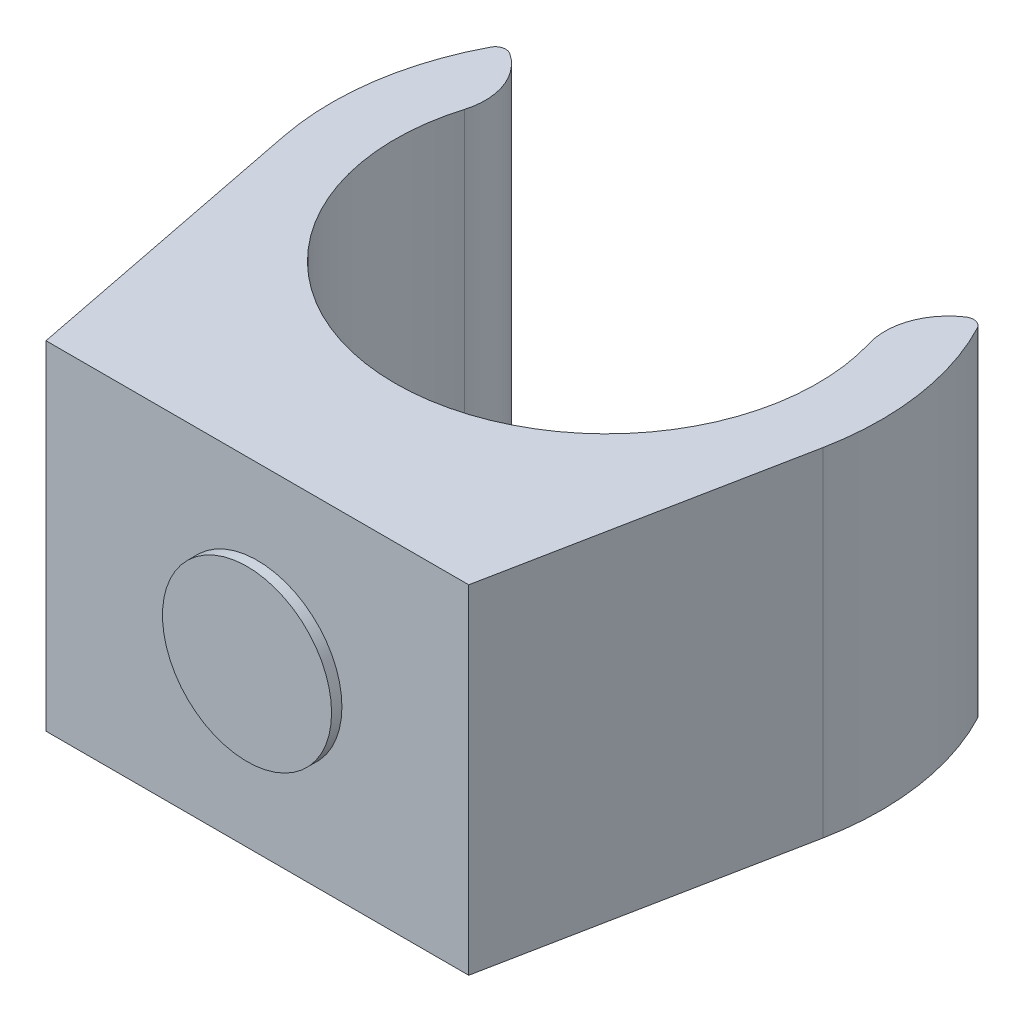
ISO-10303-21;
HEADER;
FILE_DESCRIPTION(('STEP AP214'),'2;1');
FILE_NAME('part.step','',(''),(''),'','','');
FILE_SCHEMA(('AUTOMOTIVE_DESIGN { 1 0 10303 214 1 1 1 1 }'));
ENDSEC;
DATA;
#1=APPLICATION_CONTEXT('core data for automotive mechanical design processes');
#2=APPLICATION_PROTOCOL_DEFINITION('international standard','automotive_design',2000,#1);
#3=PRODUCT_CONTEXT('',#1,'mechanical');
#4=PRODUCT('Part','Part','',(#3));
#5=PRODUCT_RELATED_PRODUCT_CATEGORY('part','',(#4));
#6=PRODUCT_DEFINITION_FORMATION('','',#4);
#7=PRODUCT_DEFINITION_CONTEXT('part definition',#1,'design');
#8=PRODUCT_DEFINITION('design','',#6,#7);
#9=PRODUCT_DEFINITION_SHAPE('','',#8);
#10=(LENGTH_UNIT() NAMED_UNIT(*) SI_UNIT(.MILLI.,.METRE.));
#11=(NAMED_UNIT(*) PLANE_ANGLE_UNIT() SI_UNIT($,.RADIAN.));
#12=(NAMED_UNIT(*) SI_UNIT($,.STERADIAN.) SOLID_ANGLE_UNIT());
#13=UNCERTAINTY_MEASURE_WITH_UNIT(LENGTH_MEASURE(1.E-05),#10,'distance_accuracy_value','');
#14=(GEOMETRIC_REPRESENTATION_CONTEXT(3) GLOBAL_UNCERTAINTY_ASSIGNED_CONTEXT((#13)) GLOBAL_UNIT_ASSIGNED_CONTEXT((#10,
#11,#12)) REPRESENTATION_CONTEXT('',''));
#15=CARTESIAN_POINT('',(0.,0.,0.));
#16=DIRECTION('',(0.,0.,1.));
#17=DIRECTION('',(1.,0.,0.));
#18=AXIS2_PLACEMENT_3D('',#15,#16,#17);
#19=CARTESIAN_POINT('',(0.,16.,0.));
#20=DIRECTION('',(0.,-1.,0.));
#21=DIRECTION('',(0.,0.,-1.));
#22=AXIS2_PLACEMENT_3D('',#19,#20,#21);
#23=CYLINDRICAL_SURFACE('',#22,13.);
#24=DIRECTION('',(0.,1.,0.));
#25=VECTOR('',#24,1.);
#26=CARTESIAN_POINT('',(-12.7553175190089,-29.0996993118991,2.51035355861762));
#27=LINE('',#26,#25);
#28=CARTESIAN_POINT('',(-12.7553175190089,0.,2.51035355861762));
#29=VERTEX_POINT('',#28);
#30=CARTESIAN_POINT('',(-12.7553175190089,16.,2.51035355861762));
#31=VERTEX_POINT('',#30);
#32=EDGE_CURVE('E60',#29,#31,#27,.T.);
#33=ORIENTED_EDGE('',*,*,#32,.T.);
#34=CARTESIAN_POINT('',(0.,16.,0.));
#35=DIRECTION('',(0.,1.,0.));
#36=DIRECTION('',(0.,0.,1.));
#37=AXIS2_PLACEMENT_3D('',#34,#35,#36);
#38=CIRCLE('',#37,13.);
#39=CARTESIAN_POINT('',(-11.5117782980847,16.,-6.03978148741711));
#40=VERTEX_POINT('',#39);
#41=EDGE_CURVE('E139',#40,#31,#38,.T.);
#42=ORIENTED_EDGE('',*,*,#41,.F.);
#43=DIRECTION('',(0.,-1.,0.));
#44=VECTOR('',#43,1.);
#45=CARTESIAN_POINT('',(-11.5117782980847,16.,-6.03978148741711));
#46=LINE('',#45,#44);
#47=CARTESIAN_POINT('',(-11.5117782980847,0.,-6.03978148741711));
#48=VERTEX_POINT('',#47);
#49=EDGE_CURVE('E186',#40,#48,#46,.T.);
#50=ORIENTED_EDGE('',*,*,#49,.T.);
#51=CARTESIAN_POINT('',(0.,0.,0.));
#52=DIRECTION('',(0.,1.,0.));
#53=DIRECTION('',(0.,0.,1.));
#54=AXIS2_PLACEMENT_3D('',#51,#52,#53);
#55=CIRCLE('',#54,13.);
#56=EDGE_CURVE('E158',#48,#29,#55,.T.);
#57=ORIENTED_EDGE('',*,*,#56,.T.);
#58=EDGE_LOOP('',(#33,#42,#50,#57));
#59=FACE_BOUND('',#58,.T.);
#60=ADVANCED_FACE('F37',(#59),#23,.T.);
#61=CARTESIAN_POINT('',(0.,16.,0.));
#62=DIRECTION('',(0.,-1.,0.));
#63=DIRECTION('',(0.,0.,-1.));
#64=AXIS2_PLACEMENT_3D('',#61,#62,#63);
#65=CYLINDRICAL_SURFACE('',#64,10.);
#66=DIRECTION('',(0.,-1.,0.));
#67=VECTOR('',#66,1.);
#68=CARTESIAN_POINT('',(9.58034703854102,16.,-2.8665223915257));
#69=LINE('',#68,#67);
#70=CARTESIAN_POINT('',(9.58034703854102,16.,-2.8665223915257));
#71=VERTEX_POINT('',#70);
#72=CARTESIAN_POINT('',(9.58034703854102,0.,-2.8665223915257));
#73=VERTEX_POINT('',#72);
#74=EDGE_CURVE('E168',#71,#73,#69,.T.);
#75=ORIENTED_EDGE('',*,*,#74,.T.);
#76=CARTESIAN_POINT('',(0.,0.,0.));
#77=DIRECTION('',(0.,1.,0.));
#78=DIRECTION('',(0.,0.,1.));
#79=AXIS2_PLACEMENT_3D('',#76,#77,#78);
#80=CIRCLE('',#79,10.);
#81=CARTESIAN_POINT('',(-9.58034703854102,0.,-2.8665223915257));
#82=VERTEX_POINT('',#81);
#83=EDGE_CURVE('E155',#82,#73,#80,.T.);
#84=ORIENTED_EDGE('',*,*,#83,.F.);
#85=DIRECTION('',(0.,-1.,0.));
#86=VECTOR('',#85,1.);
#87=CARTESIAN_POINT('',(-9.58034703854102,16.,-2.8665223915257));
#88=LINE('',#87,#86);
#89=CARTESIAN_POINT('',(-9.58034703854102,16.,-2.8665223915257));
#90=VERTEX_POINT('',#89);
#91=EDGE_CURVE('E171',#82,#90,#88,.F.);
#92=ORIENTED_EDGE('',*,*,#91,.T.);
#93=CARTESIAN_POINT('',(0.,16.,0.));
#94=DIRECTION('',(0.,1.,0.));
#95=DIRECTION('',(0.,0.,1.));
#96=AXIS2_PLACEMENT_3D('',#93,#94,#95);
#97=CIRCLE('',#96,10.);
#98=EDGE_CURVE('E156',#90,#71,#97,.T.);
#99=ORIENTED_EDGE('',*,*,#98,.T.);
#100=EDGE_LOOP('',(#75,#84,#92,#99));
#101=FACE_BOUND('',#100,.T.);
#102=ADVANCED_FACE('F223',(#101),#65,.F.);
#103=CARTESIAN_POINT('',(12.7553175190089,16.,2.51035355861762));
#104=VERTEX_POINT('',#103);
#105=CARTESIAN_POINT('',(11.5117782980847,16.,-6.03978148741711));
#106=VERTEX_POINT('',#105);
#107=EDGE_CURVE('E52',#104,#106,#38,.T.);
#108=ORIENTED_EDGE('',*,*,#107,.F.);
#109=DIRECTION('',(0.,1.,0.));
#110=VECTOR('',#109,1.);
#111=CARTESIAN_POINT('',(12.7553175190089,-29.0996993118991,2.51035355861762));
#112=LINE('',#111,#110);
#113=CARTESIAN_POINT('',(12.7553175190089,0.,2.51035355861762));
#114=VERTEX_POINT('',#113);
#115=EDGE_CURVE('E146',#114,#104,#112,.T.);
#116=ORIENTED_EDGE('',*,*,#115,.F.);
#117=CARTESIAN_POINT('',(11.5117782980847,0.,-6.03978148741711));
#118=VERTEX_POINT('',#117);
#119=EDGE_CURVE('E162',#114,#118,#55,.T.);
#120=ORIENTED_EDGE('',*,*,#119,.T.);
#121=DIRECTION('',(0.,-1.,0.));
#122=VECTOR('',#121,1.);
#123=CARTESIAN_POINT('',(11.5117782980847,16.,-6.03978148741711));
#124=LINE('',#123,#122);
#125=EDGE_CURVE('E189',#118,#106,#124,.F.);
#126=ORIENTED_EDGE('',*,*,#125,.T.);
#127=EDGE_LOOP('',(#108,#116,#120,#126));
#128=FACE_BOUND('',#127,.T.);
#129=ADVANCED_FACE('F213',(#128),#23,.T.);
#130=CARTESIAN_POINT('',(-25.4204887836564,16.,3.25000000000001));
#131=DIRECTION('',(0.,1.,0.));
#132=DIRECTION('',(0.,0.,1.));
#133=AXIS2_PLACEMENT_3D('',#130,#131,#132);
#134=PLANE('',#133);
#135=CARTESIAN_POINT('',(12.4544511501033,16.,-3.72647910898341));
#136=DIRECTION('',(0.,1.,0.));
#137=DIRECTION('',(0.,0.,1.));
#138=AXIS2_PLACEMENT_3D('',#135,#136,#137);
#139=CIRCLE('',#138,3.);
#140=CARTESIAN_POINT('',(10.791930883154,16.,-6.22368281753075));
#141=VERTEX_POINT('',#140);
#142=EDGE_CURVE('E173',#141,#71,#139,.T.);
#143=ORIENTED_EDGE('',*,*,#142,.T.);
#144=ORIENTED_EDGE('',*,*,#98,.F.);
#145=CARTESIAN_POINT('',(-12.4544511501033,16.,-3.72647910898341));
#146=DIRECTION('',(0.,1.,0.));
#147=DIRECTION('',(0.,0.,1.));
#148=AXIS2_PLACEMENT_3D('',#145,#146,#147);
#149=CIRCLE('',#148,3.);
#150=CARTESIAN_POINT('',(-10.791930883154,16.,-6.22368281753076));
#151=VERTEX_POINT('',#150);
#152=EDGE_CURVE('E175',#90,#151,#149,.T.);
#153=ORIENTED_EDGE('',*,*,#152,.T.);
#154=CARTESIAN_POINT('',(-11.0690175943122,16.,-5.80748219943953));
#155=DIRECTION('',(0.,1.,0.));
#156=DIRECTION('',(0.,0.,1.));
#157=AXIS2_PLACEMENT_3D('',#154,#155,#156);
#158=CIRCLE('',#157,0.5);
#159=EDGE_CURVE('E191',#151,#40,#158,.T.);
#160=ORIENTED_EDGE('',*,*,#159,.T.);
#161=ORIENTED_EDGE('',*,*,#41,.T.);
#162=DIRECTION('',(0.193104119893663,0.,0.981178270692994));
#163=VECTOR('',#162,1.);
#164=CARTESIAN_POINT('',(-12.7553175190089,16.,2.51035355861762));
#165=LINE('',#164,#163);
#166=CARTESIAN_POINT('',(-10.,16.,16.5103535586176));
#167=VERTEX_POINT('',#166);
#168=EDGE_CURVE('E121',#31,#167,#165,.T.);
#169=ORIENTED_EDGE('',*,*,#168,.T.);
#170=DIRECTION('',(1.,0.,0.));
#171=VECTOR('',#170,1.);
#172=CARTESIAN_POINT('',(-10.,16.,16.5103535586176));
#173=LINE('',#172,#171);
#174=CARTESIAN_POINT('',(10.,16.,16.5103535586176));
#175=VERTEX_POINT('',#174);
#176=EDGE_CURVE('E129',#167,#175,#173,.T.);
#177=ORIENTED_EDGE('',*,*,#176,.T.);
#178=DIRECTION('',(0.193104119893663,0.,-0.981178270692994));
#179=VECTOR('',#178,1.);
#180=CARTESIAN_POINT('',(12.7553175190089,16.,2.51035355861762));
#181=LINE('',#180,#179);
#182=EDGE_CURVE('E135',#175,#104,#181,.T.);
#183=ORIENTED_EDGE('',*,*,#182,.T.);
#184=ORIENTED_EDGE('',*,*,#107,.T.);
#185=CARTESIAN_POINT('',(11.0690175943122,16.,-5.80748219943953));
#186=DIRECTION('',(0.,1.,0.));
#187=DIRECTION('',(0.,0.,1.));
#188=AXIS2_PLACEMENT_3D('',#185,#186,#187);
#189=CIRCLE('',#188,0.5);
#190=EDGE_CURVE('E193',#106,#141,#189,.T.);
#191=ORIENTED_EDGE('',*,*,#190,.T.);
#192=EDGE_LOOP('',(#143,#144,#153,#160,#161,#169,#177,#183,#184,#191));
#193=FACE_BOUND('',#192,.T.);
#194=ADVANCED_FACE('F138',(#193),#134,.T.);
#195=CARTESIAN_POINT('',(-25.4204887836564,0.,3.25000000000001));
#196=DIRECTION('',(0.,1.,0.));
#197=DIRECTION('',(0.,0.,1.));
#198=AXIS2_PLACEMENT_3D('',#195,#196,#197);
#199=PLANE('',#198);
#200=ORIENTED_EDGE('',*,*,#119,.F.);
#201=DIRECTION('',(-0.193104119893663,0.,0.981178270692994));
#202=VECTOR('',#201,1.);
#203=CARTESIAN_POINT('',(12.7553175190089,0.,2.51035355861762));
#204=LINE('',#203,#202);
#205=CARTESIAN_POINT('',(10.,0.,16.5103535586176));
#206=VERTEX_POINT('',#205);
#207=EDGE_CURVE('E142',#114,#206,#204,.T.);
#208=ORIENTED_EDGE('',*,*,#207,.T.);
#209=DIRECTION('',(-1.,0.,0.));
#210=VECTOR('',#209,1.);
#211=CARTESIAN_POINT('',(-10.,0.,16.5103535586176));
#212=LINE('',#211,#210);
#213=CARTESIAN_POINT('',(-10.,0.,16.5103535586176));
#214=VERTEX_POINT('',#213);
#215=EDGE_CURVE('E148',#206,#214,#212,.T.);
#216=ORIENTED_EDGE('',*,*,#215,.T.);
#217=DIRECTION('',(-0.193104119893663,0.,-0.981178270692994));
#218=VECTOR('',#217,1.);
#219=CARTESIAN_POINT('',(-12.7553175190089,0.,2.51035355861762));
#220=LINE('',#219,#218);
#221=EDGE_CURVE('E123',#214,#29,#220,.T.);
#222=ORIENTED_EDGE('',*,*,#221,.T.);
#223=ORIENTED_EDGE('',*,*,#56,.F.);
#224=CARTESIAN_POINT('',(-11.0690175943122,0.,-5.80748219943953));
#225=DIRECTION('',(0.,1.,0.));
#226=DIRECTION('',(0.,0.,1.));
#227=AXIS2_PLACEMENT_3D('',#224,#225,#226);
#228=CIRCLE('',#227,0.5);
#229=CARTESIAN_POINT('',(-10.791930883154,0.,-6.22368281753076));
#230=VERTEX_POINT('',#229);
#231=EDGE_CURVE('E181',#48,#230,#228,.F.);
#232=ORIENTED_EDGE('',*,*,#231,.T.);
#233=CARTESIAN_POINT('',(-12.4544511501033,0.,-3.72647910898341));
#234=DIRECTION('',(0.,1.,0.));
#235=DIRECTION('',(0.,0.,1.));
#236=AXIS2_PLACEMENT_3D('',#233,#234,#235);
#237=CIRCLE('',#236,3.);
#238=EDGE_CURVE('E166',#230,#82,#237,.F.);
#239=ORIENTED_EDGE('',*,*,#238,.T.);
#240=ORIENTED_EDGE('',*,*,#83,.T.);
#241=CARTESIAN_POINT('',(12.4544511501033,0.,-3.72647910898341));
#242=DIRECTION('',(0.,1.,0.));
#243=DIRECTION('',(0.,0.,1.));
#244=AXIS2_PLACEMENT_3D('',#241,#242,#243);
#245=CIRCLE('',#244,3.);
#246=CARTESIAN_POINT('',(10.791930883154,0.,-6.22368281753075));
#247=VERTEX_POINT('',#246);
#248=EDGE_CURVE('E160',#73,#247,#245,.F.);
#249=ORIENTED_EDGE('',*,*,#248,.T.);
#250=CARTESIAN_POINT('',(11.0690175943122,0.,-5.80748219943953));
#251=DIRECTION('',(0.,1.,0.));
#252=DIRECTION('',(0.,0.,1.));
#253=AXIS2_PLACEMENT_3D('',#250,#251,#252);
#254=CIRCLE('',#253,0.5);
#255=EDGE_CURVE('E183',#247,#118,#254,.F.);
#256=ORIENTED_EDGE('',*,*,#255,.T.);
#257=EDGE_LOOP('',(#200,#208,#216,#222,#223,#232,#239,#240,#249,#256));
#258=FACE_BOUND('',#257,.T.);
#259=ADVANCED_FACE('F206',(#258),#199,.F.);
#260=CARTESIAN_POINT('',(-12.4544511501033,16.,-3.72647910898341));
#261=DIRECTION('',(0.,-1.,0.));
#262=DIRECTION('',(0.,0.,-1.));
#263=AXIS2_PLACEMENT_3D('',#260,#261,#262);
#264=CYLINDRICAL_SURFACE('',#263,3.);
#265=ORIENTED_EDGE('',*,*,#238,.F.);
#266=DIRECTION('',(0.,-1.,0.));
#267=VECTOR('',#266,1.);
#268=CARTESIAN_POINT('',(-10.791930883154,16.,-6.22368281753076));
#269=LINE('',#268,#267);
#270=EDGE_CURVE('E45',#230,#151,#269,.F.);
#271=ORIENTED_EDGE('',*,*,#270,.T.);
#272=ORIENTED_EDGE('',*,*,#152,.F.);
#273=ORIENTED_EDGE('',*,*,#91,.F.);
#274=EDGE_LOOP('',(#265,#271,#272,#273));
#275=FACE_BOUND('',#274,.T.);
#276=ADVANCED_FACE('F198',(#275),#264,.T.);
#277=CARTESIAN_POINT('',(12.4544511501033,16.,-3.72647910898341));
#278=DIRECTION('',(0.,-1.,0.));
#279=DIRECTION('',(0.,0.,-1.));
#280=AXIS2_PLACEMENT_3D('',#277,#278,#279);
#281=CYLINDRICAL_SURFACE('',#280,3.);
#282=ORIENTED_EDGE('',*,*,#142,.F.);
#283=DIRECTION('',(0.,-1.,0.));
#284=VECTOR('',#283,1.);
#285=CARTESIAN_POINT('',(10.791930883154,16.,-6.22368281753075));
#286=LINE('',#285,#284);
#287=EDGE_CURVE('E178',#141,#247,#286,.T.);
#288=ORIENTED_EDGE('',*,*,#287,.T.);
#289=ORIENTED_EDGE('',*,*,#248,.F.);
#290=ORIENTED_EDGE('',*,*,#74,.F.);
#291=EDGE_LOOP('',(#282,#288,#289,#290));
#292=FACE_BOUND('',#291,.T.);
#293=ADVANCED_FACE('F219',(#292),#281,.T.);
#294=CARTESIAN_POINT('',(11.0690175943122,16.,-5.80748219943953));
#295=DIRECTION('',(0.,-1.,0.));
#296=DIRECTION('',(0.,0.,-1.));
#297=AXIS2_PLACEMENT_3D('',#294,#295,#296);
#298=CYLINDRICAL_SURFACE('',#297,0.5);
#299=ORIENTED_EDGE('',*,*,#190,.F.);
#300=ORIENTED_EDGE('',*,*,#125,.F.);
#301=ORIENTED_EDGE('',*,*,#255,.F.);
#302=ORIENTED_EDGE('',*,*,#287,.F.);
#303=EDGE_LOOP('',(#299,#300,#301,#302));
#304=FACE_BOUND('',#303,.T.);
#305=ADVANCED_FACE('F216',(#304),#298,.T.);
#306=CARTESIAN_POINT('',(-11.0690175943122,16.,-5.80748219943953));
#307=DIRECTION('',(0.,-1.,0.));
#308=DIRECTION('',(0.,0.,-1.));
#309=AXIS2_PLACEMENT_3D('',#306,#307,#308);
#310=CYLINDRICAL_SURFACE('',#309,0.5);
#311=ORIENTED_EDGE('',*,*,#159,.F.);
#312=ORIENTED_EDGE('',*,*,#270,.F.);
#313=ORIENTED_EDGE('',*,*,#231,.F.);
#314=ORIENTED_EDGE('',*,*,#49,.F.);
#315=EDGE_LOOP('',(#311,#312,#313,#314));
#316=FACE_BOUND('',#315,.T.);
#317=ADVANCED_FACE('F39',(#316),#310,.T.);
#318=CARTESIAN_POINT('',(12.7553175190089,-29.0996993118991,2.51035355861762));
#319=DIRECTION('',(0.981178270692994,0.,0.193104119893663));
#320=DIRECTION('',(0.193104119893663,0.,-0.981178270692994));
#321=AXIS2_PLACEMENT_3D('',#318,#319,#320);
#322=PLANE('',#321);
#323=ORIENTED_EDGE('',*,*,#207,.F.);
#324=ORIENTED_EDGE('',*,*,#115,.T.);
#325=ORIENTED_EDGE('',*,*,#182,.F.);
#326=DIRECTION('',(0.,1.,0.));
#327=VECTOR('',#326,1.);
#328=CARTESIAN_POINT('',(10.,-29.0996993118991,16.5103535586176));
#329=LINE('',#328,#327);
#330=EDGE_CURVE('E126',#206,#175,#329,.T.);
#331=ORIENTED_EDGE('',*,*,#330,.F.);
#332=EDGE_LOOP('',(#323,#324,#325,#331));
#333=FACE_BOUND('',#332,.T.);
#334=ADVANCED_FACE('F209',(#333),#322,.T.);
#335=CARTESIAN_POINT('',(-10.,-29.0996993118991,16.5103535586176));
#336=DIRECTION('',(0.,0.,1.));
#337=DIRECTION('',(1.,0.,0.));
#338=AXIS2_PLACEMENT_3D('',#335,#336,#337);
#339=PLANE('',#338);
#340=CARTESIAN_POINT('',(0.,8.,16.5103535586176));
#341=DIRECTION('',(0.,0.,1.));
#342=DIRECTION('',(1.,0.,0.));
#343=AXIS2_PLACEMENT_3D('',#340,#341,#342);
#344=CIRCLE('',#343,4.);
#345=CARTESIAN_POINT('',(4.,8.,16.5103535586176));
#346=VERTEX_POINT('',#345);
#347=EDGE_CURVE('E11',#346,#346,#344,.F.);
#348=ORIENTED_EDGE('',*,*,#347,.T.);
#349=EDGE_LOOP('',(#348));
#350=FACE_BOUND('',#349,.T.);
#351=ORIENTED_EDGE('',*,*,#215,.F.);
#352=ORIENTED_EDGE('',*,*,#330,.T.);
#353=ORIENTED_EDGE('',*,*,#176,.F.);
#354=DIRECTION('',(0.,1.,0.));
#355=VECTOR('',#354,1.);
#356=CARTESIAN_POINT('',(-10.,-29.0996993118991,16.5103535586176));
#357=LINE('',#356,#355);
#358=EDGE_CURVE('E117',#214,#167,#357,.T.);
#359=ORIENTED_EDGE('',*,*,#358,.F.);
#360=EDGE_LOOP('',(#351,#352,#353,#359));
#361=FACE_BOUND('',#360,.T.);
#362=ADVANCED_FACE('F130',(#350,#361),#339,.T.);
#363=CARTESIAN_POINT('',(-12.7553175190089,-29.0996993118991,2.51035355861762));
#364=DIRECTION('',(-0.981178270692994,0.,0.193104119893663));
#365=DIRECTION('',(0.193104119893663,0.,0.981178270692994));
#366=AXIS2_PLACEMENT_3D('',#363,#364,#365);
#367=PLANE('',#366);
#368=ORIENTED_EDGE('',*,*,#221,.F.);
#369=ORIENTED_EDGE('',*,*,#358,.T.);
#370=ORIENTED_EDGE('',*,*,#168,.F.);
#371=ORIENTED_EDGE('',*,*,#32,.F.);
#372=EDGE_LOOP('',(#368,#369,#370,#371));
#373=FACE_BOUND('',#372,.T.);
#374=ADVANCED_FACE('F119',(#373),#367,.T.);
#375=CARTESIAN_POINT('',(0.,8.,17.));
#376=DIRECTION('',(0.,0.,1.));
#377=DIRECTION('',(1.,0.,0.));
#378=AXIS2_PLACEMENT_3D('',#375,#376,#377);
#379=PLANE('',#378);
#380=CARTESIAN_POINT('',(0.,8.,17.));
#381=DIRECTION('',(0.,0.,1.));
#382=DIRECTION('',(1.,0.,0.));
#383=AXIS2_PLACEMENT_3D('',#380,#381,#382);
#384=CIRCLE('',#383,4.);
#385=CARTESIAN_POINT('',(4.,8.,17.));
#386=VERTEX_POINT('',#385);
#387=EDGE_CURVE('E152',#386,#386,#384,.T.);
#388=ORIENTED_EDGE('',*,*,#387,.T.);
#389=EDGE_LOOP('',(#388));
#390=FACE_BOUND('',#389,.T.);
#391=ADVANCED_FACE('F252',(#390),#379,.T.);
#392=CARTESIAN_POINT('',(0.,8.,-6.50099999999997));
#393=DIRECTION('',(0.,0.,1.));
#394=DIRECTION('',(1.,0.,0.));
#395=AXIS2_PLACEMENT_3D('',#392,#393,#394);
#396=CYLINDRICAL_SURFACE('',#395,4.);
#397=ORIENTED_EDGE('',*,*,#347,.F.);
#398=EDGE_LOOP('',(#397));
#399=FACE_BOUND('',#398,.T.);
#400=ORIENTED_EDGE('',*,*,#387,.F.);
#401=EDGE_LOOP('',(#400));
#402=FACE_BOUND('',#401,.T.);
#403=ADVANCED_FACE('F255',(#399,#402),#396,.T.);
#404=CLOSED_SHELL('',(#60,#102,#129,#194,#259,#276,#293,#305,#317,#334,#362,#374,#391,#403));
#405=MANIFOLD_SOLID_BREP('B2',#404);
#406=ADVANCED_BREP_SHAPE_REPRESENTATION('',(#18,#405),#14);
#407=SHAPE_DEFINITION_REPRESENTATION(#9,#406);
ENDSEC;
END-ISO-10303-21;
